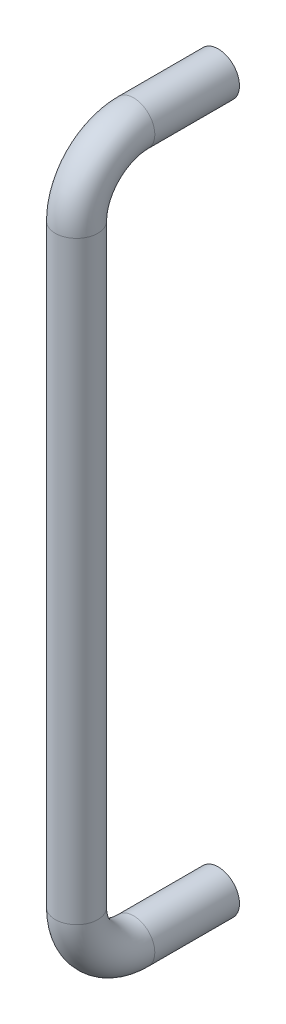
ISO-10303-21;
HEADER;
FILE_DESCRIPTION(('STEP AP214'),'2;1');
FILE_NAME('part.step','',(''),(''),'','','');
FILE_SCHEMA(('AUTOMOTIVE_DESIGN { 1 0 10303 214 1 1 1 1 }'));
ENDSEC;
DATA;
#1=APPLICATION_CONTEXT('core data for automotive mechanical design processes');
#2=APPLICATION_PROTOCOL_DEFINITION('international standard','automotive_design',2000,#1);
#3=PRODUCT_CONTEXT('',#1,'mechanical');
#4=PRODUCT('Part','Part','',(#3));
#5=PRODUCT_RELATED_PRODUCT_CATEGORY('part','',(#4));
#6=PRODUCT_DEFINITION_FORMATION('','',#4);
#7=PRODUCT_DEFINITION_CONTEXT('part definition',#1,'design');
#8=PRODUCT_DEFINITION('design','',#6,#7);
#9=PRODUCT_DEFINITION_SHAPE('','',#8);
#10=(LENGTH_UNIT() NAMED_UNIT(*) SI_UNIT(.MILLI.,.METRE.));
#11=(NAMED_UNIT(*) PLANE_ANGLE_UNIT() SI_UNIT($,.RADIAN.));
#12=(NAMED_UNIT(*) SI_UNIT($,.STERADIAN.) SOLID_ANGLE_UNIT());
#13=UNCERTAINTY_MEASURE_WITH_UNIT(LENGTH_MEASURE(1.E-05),#10,'distance_accuracy_value','');
#14=(GEOMETRIC_REPRESENTATION_CONTEXT(3) GLOBAL_UNCERTAINTY_ASSIGNED_CONTEXT((#13)) GLOBAL_UNIT_ASSIGNED_CONTEXT((#10,
#11,#12)) REPRESENTATION_CONTEXT('',''));
#15=CARTESIAN_POINT('',(0.,0.,0.));
#16=DIRECTION('',(0.,0.,1.));
#17=DIRECTION('',(1.,0.,0.));
#18=AXIS2_PLACEMENT_3D('',#15,#16,#17);
#19=CARTESIAN_POINT('',(0.,0.,0.));
#20=DIRECTION('',(0.,0.,1.));
#21=DIRECTION('',(1.,0.,0.));
#22=AXIS2_PLACEMENT_3D('',#19,#20,#21);
#23=PLANE('',#22);
#24=CARTESIAN_POINT('',(0.,0.,0.));
#25=DIRECTION('',(0.,0.,1.));
#26=DIRECTION('',(1.,0.,0.));
#27=AXIS2_PLACEMENT_3D('',#24,#25,#26);
#28=CIRCLE('',#27,0.15);
#29=CARTESIAN_POINT('',(0.15,0.,0.));
#30=VERTEX_POINT('',#29);
#31=EDGE_CURVE('E18',#30,#30,#28,.T.);
#32=ORIENTED_EDGE('',*,*,#31,.F.);
#33=EDGE_LOOP('',(#32));
#34=FACE_BOUND('',#33,.T.);
#35=ADVANCED_FACE('F15',(#34),#23,.F.);
#36=CARTESIAN_POINT('',(0.,5.,0.));
#37=DIRECTION('',(0.,0.,-1.));
#38=DIRECTION('',(-1.,0.,0.));
#39=AXIS2_PLACEMENT_3D('',#36,#37,#38);
#40=PLANE('',#39);
#41=CARTESIAN_POINT('',(0.,5.,0.));
#42=DIRECTION('',(0.,0.,-1.));
#43=DIRECTION('',(-1.,0.,0.));
#44=AXIS2_PLACEMENT_3D('',#41,#42,#43);
#45=CIRCLE('',#44,0.15);
#46=CARTESIAN_POINT('',(-0.15,5.,0.));
#47=VERTEX_POINT('',#46);
#48=EDGE_CURVE('E50',#47,#47,#45,.F.);
#49=ORIENTED_EDGE('',*,*,#48,.F.);
#50=EDGE_LOOP('',(#49));
#51=FACE_BOUND('',#50,.T.);
#52=ADVANCED_FACE('F60',(#51),#40,.T.);
#53=CARTESIAN_POINT('',(0.,0.,0.597576790725));
#54=DIRECTION('',(0.,0.,1.));
#55=DIRECTION('',(1.,0.,0.));
#56=AXIS2_PLACEMENT_3D('',#53,#54,#55);
#57=CYLINDRICAL_SURFACE('',#56,0.15);
#58=CARTESIAN_POINT('',(0.,0.,0.597576790725));
#59=DIRECTION('',(0.,0.,-1.));
#60=DIRECTION('',(0.,-1.,0.));
#61=AXIS2_PLACEMENT_3D('',#58,#59,#60);
#62=CIRCLE('',#61,0.15);
#63=CARTESIAN_POINT('',(0.,-0.15,0.597576790725));
#64=VERTEX_POINT('',#63);
#65=EDGE_CURVE('E48',#64,#64,#62,.F.);
#66=ORIENTED_EDGE('',*,*,#65,.F.);
#67=EDGE_LOOP('',(#66));
#68=FACE_BOUND('',#67,.T.);
#69=ORIENTED_EDGE('',*,*,#31,.T.);
#70=EDGE_LOOP('',(#69));
#71=FACE_BOUND('',#70,.T.);
#72=ADVANCED_FACE('F57',(#68,#71),#57,.T.);
#73=CARTESIAN_POINT('',(0.,5.,0.));
#74=DIRECTION('',(0.,0.,-1.));
#75=DIRECTION('',(-1.,0.,0.));
#76=AXIS2_PLACEMENT_3D('',#73,#74,#75);
#77=CYLINDRICAL_SURFACE('',#76,0.15);
#78=ORIENTED_EDGE('',*,*,#48,.T.);
#79=EDGE_LOOP('',(#78));
#80=FACE_BOUND('',#79,.T.);
#81=CARTESIAN_POINT('',(0.,5.,0.597576790725));
#82=DIRECTION('',(0.,0.,1.));
#83=DIRECTION('',(0.,1.,0.));
#84=AXIS2_PLACEMENT_3D('',#81,#82,#83);
#85=CIRCLE('',#84,0.15);
#86=CARTESIAN_POINT('',(0.,5.15,0.597576790725));
#87=VERTEX_POINT('',#86);
#88=EDGE_CURVE('E27',#87,#87,#85,.T.);
#89=ORIENTED_EDGE('',*,*,#88,.F.);
#90=EDGE_LOOP('',(#89));
#91=FACE_BOUND('',#90,.T.);
#92=ADVANCED_FACE('F43',(#80,#91),#77,.T.);
#93=CARTESIAN_POINT('',(0.,0.402423209275,0.597576790725));
#94=DIRECTION('',(1.,0.,0.));
#95=DIRECTION('',(0.,0.,-1.));
#96=AXIS2_PLACEMENT_3D('',#93,#94,#95);
#97=TOROIDAL_SURFACE('',#96,0.402423209275,0.15);
#98=CARTESIAN_POINT('',(0.,0.402423209275,1.));
#99=DIRECTION('',(0.,1.,0.));
#100=DIRECTION('',(0.,0.,1.));
#101=AXIS2_PLACEMENT_3D('',#98,#99,#100);
#102=CIRCLE('',#101,0.15);
#103=CARTESIAN_POINT('',(0.,0.402423209275,1.15));
#104=VERTEX_POINT('',#103);
#105=EDGE_CURVE('E22',#104,#104,#102,.T.);
#106=ORIENTED_EDGE('',*,*,#105,.F.);
#107=EDGE_LOOP('',(#106));
#108=FACE_BOUND('',#107,.T.);
#109=ORIENTED_EDGE('',*,*,#65,.T.);
#110=EDGE_LOOP('',(#109));
#111=FACE_BOUND('',#110,.T.);
#112=ADVANCED_FACE('F39',(#108,#111),#97,.T.);
#113=CARTESIAN_POINT('',(0.,4.597576790725,0.597576790725));
#114=DIRECTION('',(1.,0.,0.));
#115=DIRECTION('',(0.,0.,-1.));
#116=AXIS2_PLACEMENT_3D('',#113,#114,#115);
#117=TOROIDAL_SURFACE('',#116,0.402423209275,0.15);
#118=ORIENTED_EDGE('',*,*,#88,.T.);
#119=EDGE_LOOP('',(#118));
#120=FACE_BOUND('',#119,.T.);
#121=CARTESIAN_POINT('',(0.,4.597576790725,1.));
#122=DIRECTION('',(0.,1.,0.));
#123=DIRECTION('',(0.,0.,1.));
#124=AXIS2_PLACEMENT_3D('',#121,#122,#123);
#125=CIRCLE('',#124,0.15);
#126=CARTESIAN_POINT('',(0.,4.597576790725,1.15));
#127=VERTEX_POINT('',#126);
#128=EDGE_CURVE('E10',#127,#127,#125,.F.);
#129=ORIENTED_EDGE('',*,*,#128,.F.);
#130=EDGE_LOOP('',(#129));
#131=FACE_BOUND('',#130,.T.);
#132=ADVANCED_FACE('F34',(#120,#131),#117,.T.);
#133=CARTESIAN_POINT('',(0.,4.597576790725,1.));
#134=DIRECTION('',(0.,1.,0.));
#135=DIRECTION('',(0.,0.,1.));
#136=AXIS2_PLACEMENT_3D('',#133,#134,#135);
#137=CYLINDRICAL_SURFACE('',#136,0.15);
#138=ORIENTED_EDGE('',*,*,#128,.T.);
#139=EDGE_LOOP('',(#138));
#140=FACE_BOUND('',#139,.T.);
#141=ORIENTED_EDGE('',*,*,#105,.T.);
#142=EDGE_LOOP('',(#141));
#143=FACE_BOUND('',#142,.T.);
#144=ADVANCED_FACE('F38',(#140,#143),#137,.T.);
#145=CLOSED_SHELL('',(#35,#52,#72,#92,#112,#132,#144));
#146=MANIFOLD_SOLID_BREP('B1',#145);
#147=ADVANCED_BREP_SHAPE_REPRESENTATION('',(#18,#146),#14);
#148=SHAPE_DEFINITION_REPRESENTATION(#9,#147);
ENDSEC;
END-ISO-10303-21;
